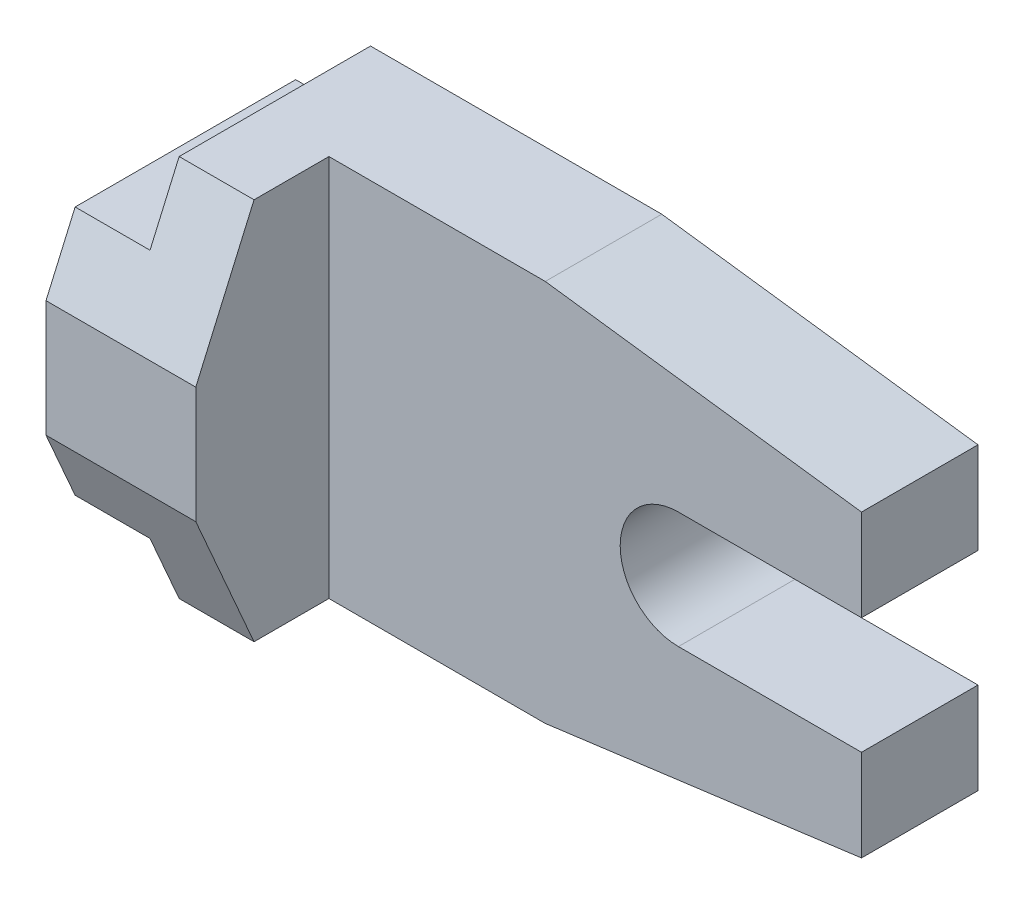
ISO-10303-21;
HEADER;
FILE_DESCRIPTION(('STEP AP214'),'2;1');
FILE_NAME('part.step','',(''),(''),'','','');
FILE_SCHEMA(('AUTOMOTIVE_DESIGN { 1 0 10303 214 1 1 1 1 }'));
ENDSEC;
DATA;
#1=APPLICATION_CONTEXT('core data for automotive mechanical design processes');
#2=APPLICATION_PROTOCOL_DEFINITION('international standard','automotive_design',2000,#1);
#3=PRODUCT_CONTEXT('',#1,'mechanical');
#4=PRODUCT('Part','Part','',(#3));
#5=PRODUCT_RELATED_PRODUCT_CATEGORY('part','',(#4));
#6=PRODUCT_DEFINITION_FORMATION('','',#4);
#7=PRODUCT_DEFINITION_CONTEXT('part definition',#1,'design');
#8=PRODUCT_DEFINITION('design','',#6,#7);
#9=PRODUCT_DEFINITION_SHAPE('','',#8);
#10=(LENGTH_UNIT() NAMED_UNIT(*) SI_UNIT(.MILLI.,.METRE.));
#11=(NAMED_UNIT(*) PLANE_ANGLE_UNIT() SI_UNIT($,.RADIAN.));
#12=(NAMED_UNIT(*) SI_UNIT($,.STERADIAN.) SOLID_ANGLE_UNIT());
#13=UNCERTAINTY_MEASURE_WITH_UNIT(LENGTH_MEASURE(1.E-05),#10,'distance_accuracy_value','');
#14=(GEOMETRIC_REPRESENTATION_CONTEXT(3) GLOBAL_UNCERTAINTY_ASSIGNED_CONTEXT((#13)) GLOBAL_UNIT_ASSIGNED_CONTEXT((#10,
#11,#12)) REPRESENTATION_CONTEXT('',''));
#15=CARTESIAN_POINT('',(0.,0.,0.));
#16=DIRECTION('',(0.,0.,1.));
#17=DIRECTION('',(1.,0.,0.));
#18=AXIS2_PLACEMENT_3D('',#15,#16,#17);
#19=CARTESIAN_POINT('',(-60.,23.,14.));
#20=DIRECTION('',(0.,0.,-1.));
#21=DIRECTION('',(-1.,0.,0.));
#22=AXIS2_PLACEMENT_3D('',#19,#20,#21);
#23=PLANE('',#22);
#24=DIRECTION('',(-1.,0.,0.));
#25=VECTOR('',#24,1.);
#26=CARTESIAN_POINT('',(0.,23.,14.));
#27=LINE('',#26,#25);
#28=CARTESIAN_POINT('',(-16.,23.,14.));
#29=VERTEX_POINT('',#28);
#30=CARTESIAN_POINT('',(-42.,23.,14.));
#31=VERTEX_POINT('',#30);
#32=EDGE_CURVE('E179',#29,#31,#27,.T.);
#33=ORIENTED_EDGE('',*,*,#32,.T.);
#34=DIRECTION('',(0.,-1.,0.));
#35=VECTOR('',#34,1.);
#36=CARTESIAN_POINT('',(-42.,0.,14.));
#37=LINE('',#36,#35);
#38=CARTESIAN_POINT('',(-42.,-23.,14.));
#39=VERTEX_POINT('',#38);
#40=EDGE_CURVE('E187',#31,#39,#37,.T.);
#41=ORIENTED_EDGE('',*,*,#40,.T.);
#42=DIRECTION('',(-1.,0.,0.));
#43=VECTOR('',#42,1.);
#44=CARTESIAN_POINT('',(0.,-23.,14.));
#45=LINE('',#44,#43);
#46=CARTESIAN_POINT('',(-16.,-23.,14.));
#47=VERTEX_POINT('',#46);
#48=EDGE_CURVE('E199',#47,#39,#45,.T.);
#49=ORIENTED_EDGE('',*,*,#48,.F.);
#50=DIRECTION('',(-0.991454295542544,-0.130454512571387,0.));
#51=VECTOR('',#50,1.);
#52=CARTESIAN_POINT('',(2.70251872021784,-20.5391422736555,14.));
#53=LINE('',#52,#51);
#54=CARTESIAN_POINT('',(22.,-18.,14.));
#55=VERTEX_POINT('',#54);
#56=EDGE_CURVE('E205',#55,#47,#53,.T.);
#57=ORIENTED_EDGE('',*,*,#56,.F.);
#58=DIRECTION('',(0.,-1.,0.));
#59=VECTOR('',#58,1.);
#60=CARTESIAN_POINT('',(22.,0.,14.));
#61=LINE('',#60,#59);
#62=CARTESIAN_POINT('',(22.,-7.,14.));
#63=VERTEX_POINT('',#62);
#64=EDGE_CURVE('E269',#63,#55,#61,.T.);
#65=ORIENTED_EDGE('',*,*,#64,.F.);
#66=DIRECTION('',(1.,0.,0.));
#67=VECTOR('',#66,1.);
#68=CARTESIAN_POINT('',(0.,-7.,14.));
#69=LINE('',#68,#67);
#70=CARTESIAN_POINT('',(0.,-7.,14.));
#71=VERTEX_POINT('',#70);
#72=EDGE_CURVE('E217',#71,#63,#69,.T.);
#73=ORIENTED_EDGE('',*,*,#72,.F.);
#74=CARTESIAN_POINT('',(0.,0.,14.));
#75=DIRECTION('',(0.,0.,1.));
#76=DIRECTION('',(1.,0.,0.));
#77=AXIS2_PLACEMENT_3D('',#74,#75,#76);
#78=CIRCLE('',#77,7.);
#79=CARTESIAN_POINT('',(0.,7.,14.));
#80=VERTEX_POINT('',#79);
#81=EDGE_CURVE('E214',#71,#80,#78,.F.);
#82=ORIENTED_EDGE('',*,*,#81,.T.);
#83=DIRECTION('',(1.,0.,0.));
#84=VECTOR('',#83,1.);
#85=CARTESIAN_POINT('',(0.,7.,14.));
#86=LINE('',#85,#84);
#87=CARTESIAN_POINT('',(22.,7.,14.));
#88=VERTEX_POINT('',#87);
#89=EDGE_CURVE('E211',#80,#88,#86,.T.);
#90=ORIENTED_EDGE('',*,*,#89,.T.);
#91=DIRECTION('',(0.,1.,0.));
#92=VECTOR('',#91,1.);
#93=CARTESIAN_POINT('',(22.,0.,14.));
#94=LINE('',#93,#92);
#95=CARTESIAN_POINT('',(22.,18.,14.));
#96=VERTEX_POINT('',#95);
#97=EDGE_CURVE('E203',#88,#96,#94,.T.);
#98=ORIENTED_EDGE('',*,*,#97,.T.);
#99=DIRECTION('',(-0.991454295542544,0.130454512571387,0.));
#100=VECTOR('',#99,1.);
#101=CARTESIAN_POINT('',(2.70251872021784,20.5391422736555,14.));
#102=LINE('',#101,#100);
#103=EDGE_CURVE('E196',#96,#29,#102,.T.);
#104=ORIENTED_EDGE('',*,*,#103,.T.);
#105=EDGE_LOOP('',(#33,#41,#49,#57,#65,#73,#82,#90,#98,#104));
#106=FACE_BOUND('',#105,.T.);
#107=ADVANCED_FACE('F47',(#106),#23,.F.);
#108=CARTESIAN_POINT('',(22.,0.,14.));
#109=DIRECTION('',(1.,0.,0.));
#110=DIRECTION('',(0.,0.,-1.));
#111=AXIS2_PLACEMENT_3D('',#108,#109,#110);
#112=PLANE('',#111);
#113=DIRECTION('',(0.,-1.,0.));
#114=VECTOR('',#113,1.);
#115=CARTESIAN_POINT('',(22.,0.,0.));
#116=LINE('',#115,#114);
#117=CARTESIAN_POINT('',(22.,-7.,0.));
#118=VERTEX_POINT('',#117);
#119=CARTESIAN_POINT('',(22.,-18.,0.));
#120=VERTEX_POINT('',#119);
#121=EDGE_CURVE('E221',#118,#120,#116,.T.);
#122=ORIENTED_EDGE('',*,*,#121,.F.);
#123=DIRECTION('',(0.,0.,-1.));
#124=VECTOR('',#123,1.);
#125=CARTESIAN_POINT('',(22.,-7.,14.));
#126=LINE('',#125,#124);
#127=EDGE_CURVE('E272',#63,#118,#126,.T.);
#128=ORIENTED_EDGE('',*,*,#127,.F.);
#129=ORIENTED_EDGE('',*,*,#64,.T.);
#130=DIRECTION('',(0.,0.,-1.));
#131=VECTOR('',#130,1.);
#132=CARTESIAN_POINT('',(22.,-18.,14.));
#133=LINE('',#132,#131);
#134=EDGE_CURVE('E281',#55,#120,#133,.T.);
#135=ORIENTED_EDGE('',*,*,#134,.T.);
#136=EDGE_LOOP('',(#122,#128,#129,#135));
#137=FACE_BOUND('',#136,.T.);
#138=ADVANCED_FACE('F285',(#137),#112,.T.);
#139=CARTESIAN_POINT('',(22.,0.,14.));
#140=DIRECTION('',(-1.,0.,0.));
#141=DIRECTION('',(0.,0.,1.));
#142=AXIS2_PLACEMENT_3D('',#139,#140,#141);
#143=PLANE('',#142);
#144=DIRECTION('',(0.,1.,0.));
#145=VECTOR('',#144,1.);
#146=CARTESIAN_POINT('',(22.,0.,0.));
#147=LINE('',#146,#145);
#148=CARTESIAN_POINT('',(22.,7.,0.));
#149=VERTEX_POINT('',#148);
#150=CARTESIAN_POINT('',(22.,18.,0.));
#151=VERTEX_POINT('',#150);
#152=EDGE_CURVE('E315',#149,#151,#147,.T.);
#153=ORIENTED_EDGE('',*,*,#152,.T.);
#154=DIRECTION('',(0.,0.,-1.));
#155=VECTOR('',#154,1.);
#156=CARTESIAN_POINT('',(22.,18.,14.));
#157=LINE('',#156,#155);
#158=EDGE_CURVE('E310',#96,#151,#157,.T.);
#159=ORIENTED_EDGE('',*,*,#158,.F.);
#160=ORIENTED_EDGE('',*,*,#97,.F.);
#161=DIRECTION('',(0.,0.,-1.));
#162=VECTOR('',#161,1.);
#163=CARTESIAN_POINT('',(22.,7.,14.));
#164=LINE('',#163,#162);
#165=EDGE_CURVE('E302',#88,#149,#164,.T.);
#166=ORIENTED_EDGE('',*,*,#165,.T.);
#167=EDGE_LOOP('',(#153,#159,#160,#166));
#168=FACE_BOUND('',#167,.T.);
#169=ADVANCED_FACE('F313',(#168),#143,.F.);
#170=CARTESIAN_POINT('',(0.,7.,14.));
#171=DIRECTION('',(0.,1.,0.));
#172=DIRECTION('',(-1.,0.,0.));
#173=AXIS2_PLACEMENT_3D('',#170,#171,#172);
#174=PLANE('',#173);
#175=DIRECTION('',(1.,0.,0.));
#176=VECTOR('',#175,1.);
#177=CARTESIAN_POINT('',(0.,7.,0.));
#178=LINE('',#177,#176);
#179=CARTESIAN_POINT('',(0.,7.,0.));
#180=VERTEX_POINT('',#179);
#181=EDGE_CURVE('E265',#180,#149,#178,.T.);
#182=ORIENTED_EDGE('',*,*,#181,.T.);
#183=ORIENTED_EDGE('',*,*,#165,.F.);
#184=ORIENTED_EDGE('',*,*,#89,.F.);
#185=DIRECTION('',(0.,0.,-1.));
#186=VECTOR('',#185,1.);
#187=CARTESIAN_POINT('',(0.,7.,14.));
#188=LINE('',#187,#186);
#189=EDGE_CURVE('E297',#80,#180,#188,.T.);
#190=ORIENTED_EDGE('',*,*,#189,.T.);
#191=EDGE_LOOP('',(#182,#183,#184,#190));
#192=FACE_BOUND('',#191,.T.);
#193=ADVANCED_FACE('F304',(#192),#174,.F.);
#194=CARTESIAN_POINT('',(0.,0.,14.));
#195=DIRECTION('',(0.,0.,-1.));
#196=DIRECTION('',(-1.,0.,0.));
#197=AXIS2_PLACEMENT_3D('',#194,#195,#196);
#198=CYLINDRICAL_SURFACE('',#197,7.);
#199=CARTESIAN_POINT('',(0.,0.,0.));
#200=DIRECTION('',(0.,0.,1.));
#201=DIRECTION('',(1.,0.,0.));
#202=AXIS2_PLACEMENT_3D('',#199,#200,#201);
#203=CIRCLE('',#202,7.);
#204=CARTESIAN_POINT('',(0.,-7.,0.));
#205=VERTEX_POINT('',#204);
#206=EDGE_CURVE('E257',#205,#180,#203,.F.);
#207=ORIENTED_EDGE('',*,*,#206,.T.);
#208=ORIENTED_EDGE('',*,*,#189,.F.);
#209=ORIENTED_EDGE('',*,*,#81,.F.);
#210=DIRECTION('',(0.,0.,-1.));
#211=VECTOR('',#210,1.);
#212=CARTESIAN_POINT('',(0.,-7.,14.));
#213=LINE('',#212,#211);
#214=EDGE_CURVE('E290',#71,#205,#213,.T.);
#215=ORIENTED_EDGE('',*,*,#214,.T.);
#216=EDGE_LOOP('',(#207,#208,#209,#215));
#217=FACE_BOUND('',#216,.T.);
#218=ADVANCED_FACE('F298',(#217),#198,.F.);
#219=CARTESIAN_POINT('',(0.,-7.,14.));
#220=DIRECTION('',(0.,1.,0.));
#221=DIRECTION('',(-1.,0.,0.));
#222=AXIS2_PLACEMENT_3D('',#219,#220,#221);
#223=PLANE('',#222);
#224=DIRECTION('',(1.,0.,0.));
#225=VECTOR('',#224,1.);
#226=CARTESIAN_POINT('',(0.,-7.,0.));
#227=LINE('',#226,#225);
#228=EDGE_CURVE('E254',#205,#118,#227,.T.);
#229=ORIENTED_EDGE('',*,*,#228,.F.);
#230=ORIENTED_EDGE('',*,*,#214,.F.);
#231=ORIENTED_EDGE('',*,*,#72,.T.);
#232=ORIENTED_EDGE('',*,*,#127,.T.);
#233=EDGE_LOOP('',(#229,#230,#231,#232));
#234=FACE_BOUND('',#233,.T.);
#235=ADVANCED_FACE('F289',(#234),#223,.T.);
#236=CARTESIAN_POINT('',(2.70251872021784,20.5391422736555,14.));
#237=DIRECTION('',(-0.130454512571387,-0.991454295542544,0.));
#238=DIRECTION('',(0.991454295542544,-0.130454512571387,0.));
#239=AXIS2_PLACEMENT_3D('',#236,#237,#238);
#240=PLANE('',#239);
#241=DIRECTION('',(-0.991454295542544,0.130454512571387,0.));
#242=VECTOR('',#241,1.);
#243=CARTESIAN_POINT('',(2.70251872021784,20.5391422736555,0.));
#244=LINE('',#243,#242);
#245=CARTESIAN_POINT('',(-16.,23.,0.));
#246=VERTEX_POINT('',#245);
#247=EDGE_CURVE('E322',#151,#246,#244,.T.);
#248=ORIENTED_EDGE('',*,*,#247,.T.);
#249=DIRECTION('',(0.,0.,-1.));
#250=VECTOR('',#249,1.);
#251=CARTESIAN_POINT('',(-16.,23.,14.));
#252=LINE('',#251,#250);
#253=EDGE_CURVE('E319',#29,#246,#252,.T.);
#254=ORIENTED_EDGE('',*,*,#253,.F.);
#255=ORIENTED_EDGE('',*,*,#103,.F.);
#256=ORIENTED_EDGE('',*,*,#158,.T.);
#257=EDGE_LOOP('',(#248,#254,#255,#256));
#258=FACE_BOUND('',#257,.T.);
#259=ADVANCED_FACE('F321',(#258),#240,.F.);
#260=CARTESIAN_POINT('',(2.70251872021784,-20.5391422736555,14.));
#261=DIRECTION('',(0.130454512571387,-0.991454295542544,0.));
#262=DIRECTION('',(0.991454295542544,0.130454512571387,0.));
#263=AXIS2_PLACEMENT_3D('',#260,#261,#262);
#264=PLANE('',#263);
#265=DIRECTION('',(-0.991454295542544,-0.130454512571387,0.));
#266=VECTOR('',#265,1.);
#267=CARTESIAN_POINT('',(2.70251872021784,-20.5391422736555,0.));
#268=LINE('',#267,#266);
#269=CARTESIAN_POINT('',(-16.,-23.,0.));
#270=VERTEX_POINT('',#269);
#271=EDGE_CURVE('E334',#120,#270,#268,.T.);
#272=ORIENTED_EDGE('',*,*,#271,.F.);
#273=ORIENTED_EDGE('',*,*,#134,.F.);
#274=ORIENTED_EDGE('',*,*,#56,.T.);
#275=DIRECTION('',(0.,0.,-1.));
#276=VECTOR('',#275,1.);
#277=CARTESIAN_POINT('',(-16.,-23.,14.));
#278=LINE('',#277,#276);
#279=EDGE_CURVE('E279',#47,#270,#278,.T.);
#280=ORIENTED_EDGE('',*,*,#279,.T.);
#281=EDGE_LOOP('',(#272,#273,#274,#280));
#282=FACE_BOUND('',#281,.T.);
#283=ADVANCED_FACE('F278',(#282),#264,.T.);
#284=CARTESIAN_POINT('',(0.,-23.,14.));
#285=DIRECTION('',(0.,-1.,0.));
#286=DIRECTION('',(0.,0.,-1.));
#287=AXIS2_PLACEMENT_3D('',#284,#285,#286);
#288=PLANE('',#287);
#289=ORIENTED_EDGE('',*,*,#48,.T.);
#290=DIRECTION('',(0.,0.,-1.));
#291=VECTOR('',#290,1.);
#292=CARTESIAN_POINT('',(-42.,-23.,30.));
#293=LINE('',#292,#291);
#294=CARTESIAN_POINT('',(-42.,-23.,23.));
#295=VERTEX_POINT('',#294);
#296=EDGE_CURVE('E65',#295,#39,#293,.T.);
#297=ORIENTED_EDGE('',*,*,#296,.F.);
#298=DIRECTION('',(1.,0.,0.));
#299=VECTOR('',#298,1.);
#300=CARTESIAN_POINT('',(-60.,-23.,23.));
#301=LINE('',#300,#299);
#302=CARTESIAN_POINT('',(-51.,-23.,23.));
#303=VERTEX_POINT('',#302);
#304=EDGE_CURVE('E395',#303,#295,#301,.T.);
#305=ORIENTED_EDGE('',*,*,#304,.F.);
#306=DIRECTION('',(0.,0.,-1.));
#307=VECTOR('',#306,1.);
#308=CARTESIAN_POINT('',(-51.,-23.,30.));
#309=LINE('',#308,#307);
#310=CARTESIAN_POINT('',(-51.,-23.,0.));
#311=VERTEX_POINT('',#310);
#312=EDGE_CURVE('E246',#303,#311,#309,.T.);
#313=ORIENTED_EDGE('',*,*,#312,.T.);
#314=DIRECTION('',(-1.,0.,0.));
#315=VECTOR('',#314,1.);
#316=CARTESIAN_POINT('',(0.,-23.,0.));
#317=LINE('',#316,#315);
#318=EDGE_CURVE('E338',#270,#311,#317,.T.);
#319=ORIENTED_EDGE('',*,*,#318,.F.);
#320=ORIENTED_EDGE('',*,*,#279,.F.);
#321=EDGE_LOOP('',(#289,#297,#305,#313,#319,#320));
#322=FACE_BOUND('',#321,.T.);
#323=ADVANCED_FACE('F435',(#322),#288,.T.);
#324=CARTESIAN_POINT('',(0.,23.,14.));
#325=DIRECTION('',(0.,-1.,0.));
#326=DIRECTION('',(0.,0.,-1.));
#327=AXIS2_PLACEMENT_3D('',#324,#325,#326);
#328=PLANE('',#327);
#329=DIRECTION('',(0.,0.,-1.));
#330=VECTOR('',#329,1.);
#331=CARTESIAN_POINT('',(-51.,23.,30.));
#332=LINE('',#331,#330);
#333=CARTESIAN_POINT('',(-51.,23.,23.));
#334=VERTEX_POINT('',#333);
#335=CARTESIAN_POINT('',(-51.,23.,0.));
#336=VERTEX_POINT('',#335);
#337=EDGE_CURVE('E243',#334,#336,#332,.T.);
#338=ORIENTED_EDGE('',*,*,#337,.F.);
#339=DIRECTION('',(1.,0.,0.));
#340=VECTOR('',#339,1.);
#341=CARTESIAN_POINT('',(-60.,23.,23.));
#342=LINE('',#341,#340);
#343=CARTESIAN_POINT('',(-42.,23.,23.));
#344=VERTEX_POINT('',#343);
#345=EDGE_CURVE('E181',#334,#344,#342,.T.);
#346=ORIENTED_EDGE('',*,*,#345,.T.);
#347=DIRECTION('',(0.,0.,-1.));
#348=VECTOR('',#347,1.);
#349=CARTESIAN_POINT('',(-42.,23.,30.));
#350=LINE('',#349,#348);
#351=EDGE_CURVE('E175',#344,#31,#350,.T.);
#352=ORIENTED_EDGE('',*,*,#351,.T.);
#353=ORIENTED_EDGE('',*,*,#32,.F.);
#354=ORIENTED_EDGE('',*,*,#253,.T.);
#355=DIRECTION('',(-1.,0.,0.));
#356=VECTOR('',#355,1.);
#357=CARTESIAN_POINT('',(0.,23.,0.));
#358=LINE('',#357,#356);
#359=EDGE_CURVE('E342',#246,#336,#358,.T.);
#360=ORIENTED_EDGE('',*,*,#359,.T.);
#361=EDGE_LOOP('',(#338,#346,#352,#353,#354,#360));
#362=FACE_BOUND('',#361,.T.);
#363=ADVANCED_FACE('F176',(#362),#328,.F.);
#364=CARTESIAN_POINT('',(0.,0.,0.));
#365=DIRECTION('',(0.,0.,1.));
#366=DIRECTION('',(1.,0.,0.));
#367=AXIS2_PLACEMENT_3D('',#364,#365,#366);
#368=PLANE('',#367);
#369=ORIENTED_EDGE('',*,*,#228,.T.);
#370=ORIENTED_EDGE('',*,*,#121,.T.);
#371=ORIENTED_EDGE('',*,*,#271,.T.);
#372=ORIENTED_EDGE('',*,*,#318,.T.);
#373=DIRECTION('',(0.,1.,0.));
#374=VECTOR('',#373,1.);
#375=CARTESIAN_POINT('',(-51.,0.,0.));
#376=LINE('',#375,#374);
#377=CARTESIAN_POINT('',(-51.,-15.,0.));
#378=VERTEX_POINT('',#377);
#379=EDGE_CURVE('E231',#311,#378,#376,.T.);
#380=ORIENTED_EDGE('',*,*,#379,.T.);
#381=DIRECTION('',(-1.,0.,0.));
#382=VECTOR('',#381,1.);
#383=CARTESIAN_POINT('',(0.,-15.,0.));
#384=LINE('',#383,#382);
#385=CARTESIAN_POINT('',(-60.,-15.,0.));
#386=VERTEX_POINT('',#385);
#387=EDGE_CURVE('E57',#378,#386,#384,.T.);
#388=ORIENTED_EDGE('',*,*,#387,.T.);
#389=DIRECTION('',(0.,-1.,0.));
#390=VECTOR('',#389,1.);
#391=CARTESIAN_POINT('',(-60.,1.04083408558608E-13,0.));
#392=LINE('',#391,#390);
#393=CARTESIAN_POINT('',(-60.,15.,0.));
#394=VERTEX_POINT('',#393);
#395=EDGE_CURVE('E11',#394,#386,#392,.T.);
#396=ORIENTED_EDGE('',*,*,#395,.F.);
#397=DIRECTION('',(-1.,0.,0.));
#398=VECTOR('',#397,1.);
#399=CARTESIAN_POINT('',(0.,15.,0.));
#400=LINE('',#399,#398);
#401=CARTESIAN_POINT('',(-51.,15.,0.));
#402=VERTEX_POINT('',#401);
#403=EDGE_CURVE('E222',#402,#394,#400,.T.);
#404=ORIENTED_EDGE('',*,*,#403,.F.);
#405=DIRECTION('',(0.,-1.,0.));
#406=VECTOR('',#405,1.);
#407=CARTESIAN_POINT('',(-51.,0.,0.));
#408=LINE('',#407,#406);
#409=EDGE_CURVE('E226',#336,#402,#408,.T.);
#410=ORIENTED_EDGE('',*,*,#409,.F.);
#411=ORIENTED_EDGE('',*,*,#359,.F.);
#412=ORIENTED_EDGE('',*,*,#247,.F.);
#413=ORIENTED_EDGE('',*,*,#152,.F.);
#414=ORIENTED_EDGE('',*,*,#181,.F.);
#415=ORIENTED_EDGE('',*,*,#206,.F.);
#416=EDGE_LOOP('',(#369,#370,#371,#372,#380,#388,#396,#404,#410,#411,#412,#413,#414,#415));
#417=FACE_BOUND('',#416,.T.);
#418=ADVANCED_FACE('F351',(#417),#368,.F.);
#419=CARTESIAN_POINT('',(-51.,0.,30.));
#420=DIRECTION('',(1.,0.,0.));
#421=DIRECTION('',(0.,0.,-1.));
#422=AXIS2_PLACEMENT_3D('',#419,#420,#421);
#423=PLANE('',#422);
#424=DIRECTION('',(0.,0.,-1.));
#425=VECTOR('',#424,1.);
#426=CARTESIAN_POINT('',(-51.,15.,30.));
#427=LINE('',#426,#425);
#428=CARTESIAN_POINT('',(-51.,15.,26.5));
#429=VERTEX_POINT('',#428);
#430=EDGE_CURVE('E240',#429,#402,#427,.T.);
#431=ORIENTED_EDGE('',*,*,#430,.F.);
#432=DIRECTION('',(0.,-0.916157334902189,0.400818834019709));
#433=VECTOR('',#432,1.);
#434=CARTESIAN_POINT('',(-51.,1.12459016393444,32.5704918032787));
#435=LINE('',#434,#433);
#436=EDGE_CURVE('E357',#334,#429,#435,.T.);
#437=ORIENTED_EDGE('',*,*,#436,.F.);
#438=ORIENTED_EDGE('',*,*,#337,.T.);
#439=ORIENTED_EDGE('',*,*,#409,.T.);
#440=EDGE_LOOP('',(#431,#437,#438,#439));
#441=FACE_BOUND('',#440,.T.);
#442=ADVANCED_FACE('F354',(#441),#423,.F.);
#443=CARTESIAN_POINT('',(-60.,1.04083408558608E-13,30.));
#444=DIRECTION('',(1.,0.,0.));
#445=DIRECTION('',(0.,1.,0.));
#446=AXIS2_PLACEMENT_3D('',#443,#444,#445);
#447=PLANE('',#446);
#448=DIRECTION('',(0.,0.,-1.));
#449=VECTOR('',#448,1.);
#450=CARTESIAN_POINT('',(-60.,-15.,30.));
#451=LINE('',#450,#449);
#452=CARTESIAN_POINT('',(-60.,-15.,26.5));
#453=VERTEX_POINT('',#452);
#454=EDGE_CURVE('E51',#453,#386,#451,.T.);
#455=ORIENTED_EDGE('',*,*,#454,.F.);
#456=DIRECTION('',(0.,-0.916157334902189,-0.400818834019709));
#457=VECTOR('',#456,1.);
#458=CARTESIAN_POINT('',(-60.,-7.,30.));
#459=LINE('',#458,#457);
#460=CARTESIAN_POINT('',(-60.,-7.,30.));
#461=VERTEX_POINT('',#460);
#462=EDGE_CURVE('E376',#461,#453,#459,.T.);
#463=ORIENTED_EDGE('',*,*,#462,.F.);
#464=DIRECTION('',(0.,-1.,0.));
#465=VECTOR('',#464,1.);
#466=CARTESIAN_POINT('',(-60.,1.04083408558608E-13,30.));
#467=LINE('',#466,#465);
#468=CARTESIAN_POINT('',(-60.,7.,30.));
#469=VERTEX_POINT('',#468);
#470=EDGE_CURVE('E389',#469,#461,#467,.T.);
#471=ORIENTED_EDGE('',*,*,#470,.F.);
#472=DIRECTION('',(0.,-0.916157334902189,0.400818834019709));
#473=VECTOR('',#472,1.);
#474=CARTESIAN_POINT('',(-60.,7.,30.));
#475=LINE('',#474,#473);
#476=CARTESIAN_POINT('',(-60.,15.,26.5));
#477=VERTEX_POINT('',#476);
#478=EDGE_CURVE('E371',#477,#469,#475,.T.);
#479=ORIENTED_EDGE('',*,*,#478,.F.);
#480=DIRECTION('',(0.,0.,-1.));
#481=VECTOR('',#480,1.);
#482=CARTESIAN_POINT('',(-60.,15.,30.));
#483=LINE('',#482,#481);
#484=EDGE_CURVE('E227',#477,#394,#483,.T.);
#485=ORIENTED_EDGE('',*,*,#484,.T.);
#486=ORIENTED_EDGE('',*,*,#395,.T.);
#487=EDGE_LOOP('',(#455,#463,#471,#479,#485,#486));
#488=FACE_BOUND('',#487,.T.);
#489=ADVANCED_FACE('F424',(#488),#447,.F.);
#490=CARTESIAN_POINT('',(0.,15.,30.));
#491=DIRECTION('',(0.,-1.,0.));
#492=DIRECTION('',(0.,0.,-1.));
#493=AXIS2_PLACEMENT_3D('',#490,#491,#492);
#494=PLANE('',#493);
#495=ORIENTED_EDGE('',*,*,#484,.F.);
#496=DIRECTION('',(-1.,0.,0.));
#497=VECTOR('',#496,1.);
#498=CARTESIAN_POINT('',(0.,15.,26.5));
#499=LINE('',#498,#497);
#500=EDGE_CURVE('E363',#429,#477,#499,.T.);
#501=ORIENTED_EDGE('',*,*,#500,.F.);
#502=ORIENTED_EDGE('',*,*,#430,.T.);
#503=ORIENTED_EDGE('',*,*,#403,.T.);
#504=EDGE_LOOP('',(#495,#501,#502,#503));
#505=FACE_BOUND('',#504,.T.);
#506=ADVANCED_FACE('F427',(#505),#494,.F.);
#507=CARTESIAN_POINT('',(0.,-15.,30.));
#508=DIRECTION('',(0.,-1.,0.));
#509=DIRECTION('',(0.,0.,-1.));
#510=AXIS2_PLACEMENT_3D('',#507,#508,#509);
#511=PLANE('',#510);
#512=DIRECTION('',(0.,0.,-1.));
#513=VECTOR('',#512,1.);
#514=CARTESIAN_POINT('',(-51.,-15.,30.));
#515=LINE('',#514,#513);
#516=CARTESIAN_POINT('',(-51.,-15.,26.5));
#517=VERTEX_POINT('',#516);
#518=EDGE_CURVE('E248',#517,#378,#515,.T.);
#519=ORIENTED_EDGE('',*,*,#518,.F.);
#520=DIRECTION('',(-1.,0.,0.));
#521=VECTOR('',#520,1.);
#522=CARTESIAN_POINT('',(0.,-15.,26.5));
#523=LINE('',#522,#521);
#524=EDGE_CURVE('E367',#517,#453,#523,.T.);
#525=ORIENTED_EDGE('',*,*,#524,.T.);
#526=ORIENTED_EDGE('',*,*,#454,.T.);
#527=ORIENTED_EDGE('',*,*,#387,.F.);
#528=EDGE_LOOP('',(#519,#525,#526,#527));
#529=FACE_BOUND('',#528,.T.);
#530=ADVANCED_FACE('F428',(#529),#511,.T.);
#531=CARTESIAN_POINT('',(-51.,0.,30.));
#532=DIRECTION('',(-1.,0.,0.));
#533=DIRECTION('',(0.,0.,1.));
#534=AXIS2_PLACEMENT_3D('',#531,#532,#533);
#535=PLANE('',#534);
#536=ORIENTED_EDGE('',*,*,#312,.F.);
#537=DIRECTION('',(0.,0.916157334902189,0.400818834019709));
#538=VECTOR('',#537,1.);
#539=CARTESIAN_POINT('',(-51.,-1.12459016393444,32.5704918032787));
#540=LINE('',#539,#538);
#541=EDGE_CURVE('E362',#303,#517,#540,.T.);
#542=ORIENTED_EDGE('',*,*,#541,.T.);
#543=ORIENTED_EDGE('',*,*,#518,.T.);
#544=ORIENTED_EDGE('',*,*,#379,.F.);
#545=EDGE_LOOP('',(#536,#542,#543,#544));
#546=FACE_BOUND('',#545,.T.);
#547=ADVANCED_FACE('F49',(#546),#535,.T.);
#548=CARTESIAN_POINT('',(-60.,-7.,30.));
#549=DIRECTION('',(0.,-0.400818834019709,0.916157334902189));
#550=DIRECTION('',(0.,-0.916157334902189,-0.400818834019709));
#551=AXIS2_PLACEMENT_3D('',#548,#549,#550);
#552=PLANE('',#551);
#553=ORIENTED_EDGE('',*,*,#524,.F.);
#554=ORIENTED_EDGE('',*,*,#541,.F.);
#555=ORIENTED_EDGE('',*,*,#304,.T.);
#556=DIRECTION('',(0.,-0.916157334902189,-0.400818834019709));
#557=VECTOR('',#556,1.);
#558=CARTESIAN_POINT('',(-42.,-7.,30.));
#559=LINE('',#558,#557);
#560=CARTESIAN_POINT('',(-42.,-7.,30.));
#561=VERTEX_POINT('',#560);
#562=EDGE_CURVE('E380',#561,#295,#559,.T.);
#563=ORIENTED_EDGE('',*,*,#562,.F.);
#564=DIRECTION('',(1.,0.,0.));
#565=VECTOR('',#564,1.);
#566=CARTESIAN_POINT('',(-60.,-7.,30.));
#567=LINE('',#566,#565);
#568=EDGE_CURVE('E379',#461,#561,#567,.T.);
#569=ORIENTED_EDGE('',*,*,#568,.F.);
#570=ORIENTED_EDGE('',*,*,#462,.T.);
#571=EDGE_LOOP('',(#553,#554,#555,#563,#569,#570));
#572=FACE_BOUND('',#571,.T.);
#573=ADVANCED_FACE('F432',(#572),#552,.T.);
#574=CARTESIAN_POINT('',(-60.,7.,30.));
#575=DIRECTION('',(0.,0.400818834019709,0.916157334902189));
#576=DIRECTION('',(0.,-0.916157334902189,0.400818834019709));
#577=AXIS2_PLACEMENT_3D('',#574,#575,#576);
#578=PLANE('',#577);
#579=ORIENTED_EDGE('',*,*,#345,.F.);
#580=ORIENTED_EDGE('',*,*,#436,.T.);
#581=ORIENTED_EDGE('',*,*,#500,.T.);
#582=ORIENTED_EDGE('',*,*,#478,.T.);
#583=DIRECTION('',(1.,0.,0.));
#584=VECTOR('',#583,1.);
#585=CARTESIAN_POINT('',(-60.,7.,30.));
#586=LINE('',#585,#584);
#587=CARTESIAN_POINT('',(-42.,7.,30.));
#588=VERTEX_POINT('',#587);
#589=EDGE_CURVE('E193',#469,#588,#586,.T.);
#590=ORIENTED_EDGE('',*,*,#589,.T.);
#591=DIRECTION('',(0.,-0.916157334902189,0.400818834019709));
#592=VECTOR('',#591,1.);
#593=CARTESIAN_POINT('',(-42.,7.,30.));
#594=LINE('',#593,#592);
#595=EDGE_CURVE('E375',#344,#588,#594,.T.);
#596=ORIENTED_EDGE('',*,*,#595,.F.);
#597=EDGE_LOOP('',(#579,#580,#581,#582,#590,#596));
#598=FACE_BOUND('',#597,.T.);
#599=ADVANCED_FACE('F425',(#598),#578,.T.);
#600=CARTESIAN_POINT('',(0.,0.,30.));
#601=DIRECTION('',(0.,0.,1.));
#602=DIRECTION('',(1.,0.,0.));
#603=AXIS2_PLACEMENT_3D('',#600,#601,#602);
#604=PLANE('',#603);
#605=ORIENTED_EDGE('',*,*,#589,.F.);
#606=ORIENTED_EDGE('',*,*,#470,.T.);
#607=ORIENTED_EDGE('',*,*,#568,.T.);
#608=DIRECTION('',(0.,-1.,0.));
#609=VECTOR('',#608,1.);
#610=CARTESIAN_POINT('',(-42.,0.,30.));
#611=LINE('',#610,#609);
#612=EDGE_CURVE('E185',#588,#561,#611,.T.);
#613=ORIENTED_EDGE('',*,*,#612,.F.);
#614=EDGE_LOOP('',(#605,#606,#607,#613));
#615=FACE_BOUND('',#614,.T.);
#616=ADVANCED_FACE('F418',(#615),#604,.T.);
#617=CARTESIAN_POINT('',(-42.,0.,30.));
#618=DIRECTION('',(1.,0.,0.));
#619=DIRECTION('',(0.,0.,-1.));
#620=AXIS2_PLACEMENT_3D('',#617,#618,#619);
#621=PLANE('',#620);
#622=ORIENTED_EDGE('',*,*,#351,.F.);
#623=ORIENTED_EDGE('',*,*,#595,.T.);
#624=ORIENTED_EDGE('',*,*,#612,.T.);
#625=ORIENTED_EDGE('',*,*,#562,.T.);
#626=ORIENTED_EDGE('',*,*,#296,.T.);
#627=ORIENTED_EDGE('',*,*,#40,.F.);
#628=EDGE_LOOP('',(#622,#623,#624,#625,#626,#627));
#629=FACE_BOUND('',#628,.T.);
#630=ADVANCED_FACE('F188',(#629),#621,.T.);
#631=CLOSED_SHELL('',(#107,#138,#169,#193,#218,#235,#259,#283,#323,#363,#418,#442,#489,#506,
#530,#547,#573,#599,#616,#630));
#632=MANIFOLD_SOLID_BREP('B2',#631);
#633=ADVANCED_BREP_SHAPE_REPRESENTATION('',(#18,#632),#14);
#634=SHAPE_DEFINITION_REPRESENTATION(#9,#633);
ENDSEC;
END-ISO-10303-21;
